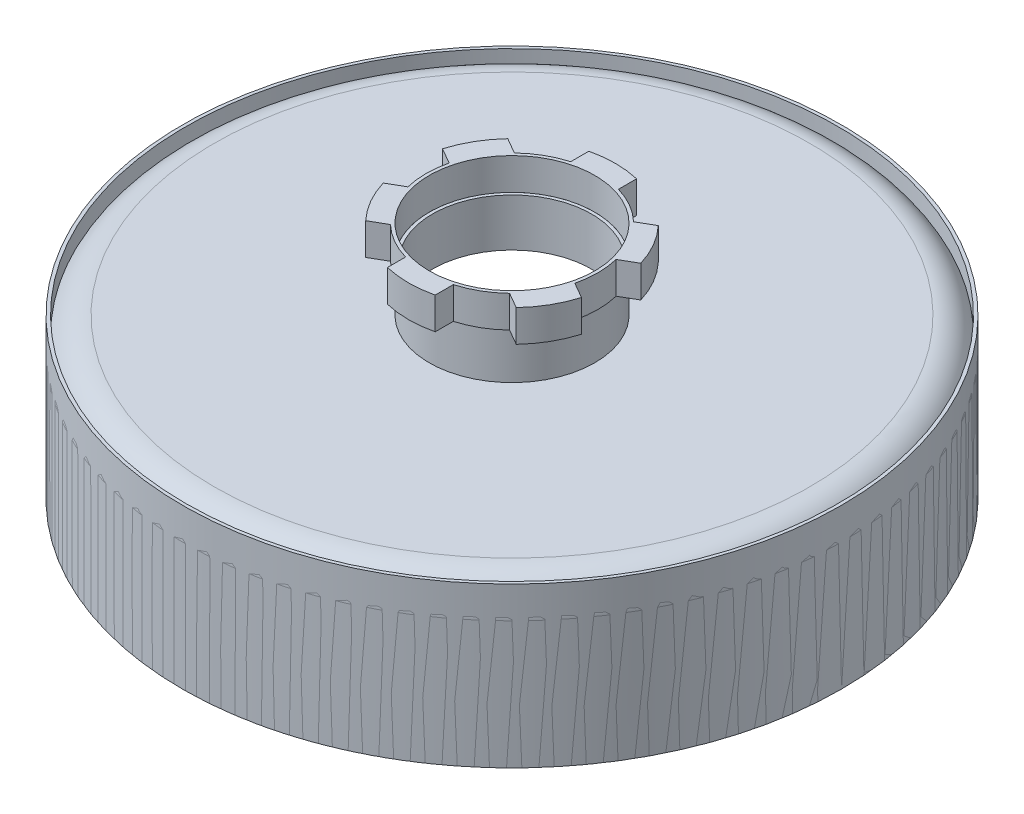
ISO-10303-21;
HEADER;
FILE_DESCRIPTION(('STEP AP214'),'2;1');
FILE_NAME('part.step','',(''),(''),'','','');
FILE_SCHEMA(('AUTOMOTIVE_DESIGN { 1 0 10303 214 1 1 1 1 }'));
ENDSEC;
DATA;
#1=APPLICATION_CONTEXT('core data for automotive mechanical design processes');
#2=APPLICATION_PROTOCOL_DEFINITION('international standard','automotive_design',2000,#1);
#3=PRODUCT_CONTEXT('',#1,'mechanical');
#4=PRODUCT('Part','Part','',(#3));
#5=PRODUCT_RELATED_PRODUCT_CATEGORY('part','',(#4));
#6=PRODUCT_DEFINITION_FORMATION('','',#4);
#7=PRODUCT_DEFINITION_CONTEXT('part definition',#1,'design');
#8=PRODUCT_DEFINITION('design','',#6,#7);
#9=PRODUCT_DEFINITION_SHAPE('','',#8);
#10=(LENGTH_UNIT() NAMED_UNIT(*) SI_UNIT(.MILLI.,.METRE.));
#11=(NAMED_UNIT(*) PLANE_ANGLE_UNIT() SI_UNIT($,.RADIAN.));
#12=(NAMED_UNIT(*) SI_UNIT($,.STERADIAN.) SOLID_ANGLE_UNIT());
#13=UNCERTAINTY_MEASURE_WITH_UNIT(LENGTH_MEASURE(1.E-05),#10,'distance_accuracy_value','');
#14=(GEOMETRIC_REPRESENTATION_CONTEXT(3) GLOBAL_UNCERTAINTY_ASSIGNED_CONTEXT((#13)) GLOBAL_UNIT_ASSIGNED_CONTEXT((#10,
#11,#12)) REPRESENTATION_CONTEXT('',''));
#15=CARTESIAN_POINT('',(0.,0.,0.));
#16=DIRECTION('',(0.,0.,1.));
#17=DIRECTION('',(1.,0.,0.));
#18=AXIS2_PLACEMENT_3D('',#15,#16,#17);
#19=CARTESIAN_POINT('',(0.,25.,0.));
#20=DIRECTION('',(0.,-1.,0.));
#21=DIRECTION('',(0.,0.,-1.));
#22=AXIS2_PLACEMENT_3D('',#19,#20,#21);
#23=CYLINDRICAL_SURFACE('',#22,27.);
#24=DIRECTION('',(0.,-1.,0.));
#25=VECTOR('',#24,1.);
#26=CARTESIAN_POINT('',(-7.50000000000018,25.,25.9374246986858));
#27=LINE('',#26,#25);
#28=CARTESIAN_POINT('',(-7.50000000000018,25.,25.9374246986858));
#29=VERTEX_POINT('',#28);
#30=CARTESIAN_POINT('',(-7.50000000000018,15.,25.9374246986858));
#31=VERTEX_POINT('',#30);
#32=EDGE_CURVE('E14',#29,#31,#27,.T.);
#33=ORIENTED_EDGE('',*,*,#32,.F.);
#34=CARTESIAN_POINT('',(0.,25.,0.));
#35=DIRECTION('',(0.,1.,0.));
#36=DIRECTION('',(1.,0.,0.));
#37=AXIS2_PLACEMENT_3D('',#34,#35,#36);
#38=CIRCLE('',#37,27.);
#39=CARTESIAN_POINT('',(-18.7124686978081,25.,19.4639028777261));
#40=VERTEX_POINT('',#39);
#41=EDGE_CURVE('E251',#40,#29,#38,.T.);
#42=ORIENTED_EDGE('',*,*,#41,.F.);
#43=DIRECTION('',(0.,-1.,0.));
#44=VECTOR('',#43,1.);
#45=CARTESIAN_POINT('',(-18.7124686978081,25.,19.4639028777261));
#46=LINE('',#45,#44);
#47=CARTESIAN_POINT('',(-18.7124686978081,15.,19.4639028777261));
#48=VERTEX_POINT('',#47);
#49=EDGE_CURVE('E413',#40,#48,#46,.T.);
#50=ORIENTED_EDGE('',*,*,#49,.T.);
#51=CARTESIAN_POINT('',(0.,15.,0.));
#52=DIRECTION('',(0.,1.,0.));
#53=DIRECTION('',(1.,0.,0.));
#54=AXIS2_PLACEMENT_3D('',#51,#52,#53);
#55=CIRCLE('',#54,27.);
#56=EDGE_CURVE('E96',#48,#31,#55,.T.);
#57=ORIENTED_EDGE('',*,*,#56,.T.);
#58=EDGE_LOOP('',(#33,#42,#50,#57));
#59=FACE_BOUND('',#58,.T.);
#60=ADVANCED_FACE('F81',(#59),#23,.T.);
#61=DIRECTION('',(0.,-1.,0.));
#62=VECTOR('',#61,1.);
#63=CARTESIAN_POINT('',(-26.212468697808,25.,6.47352182095941));
#64=LINE('',#63,#62);
#65=CARTESIAN_POINT('',(-26.212468697808,25.,6.47352182095941));
#66=VERTEX_POINT('',#65);
#67=CARTESIAN_POINT('',(-26.212468697808,15.,6.47352182095941));
#68=VERTEX_POINT('',#67);
#69=EDGE_CURVE('E415',#66,#68,#64,.T.);
#70=ORIENTED_EDGE('',*,*,#69,.F.);
#71=CARTESIAN_POINT('',(-26.2124686978078,25.,-6.47352182095995));
#72=VERTEX_POINT('',#71);
#73=EDGE_CURVE('E450',#72,#66,#38,.T.);
#74=ORIENTED_EDGE('',*,*,#73,.F.);
#75=DIRECTION('',(0.,-1.,0.));
#76=VECTOR('',#75,1.);
#77=CARTESIAN_POINT('',(-26.2124686978078,25.,-6.47352182095995));
#78=LINE('',#77,#76);
#79=CARTESIAN_POINT('',(-26.2124686978078,15.,-6.47352182095995));
#80=VERTEX_POINT('',#79);
#81=EDGE_CURVE('E407',#72,#80,#78,.T.);
#82=ORIENTED_EDGE('',*,*,#81,.T.);
#83=EDGE_CURVE('E426',#80,#68,#55,.T.);
#84=ORIENTED_EDGE('',*,*,#83,.T.);
#85=EDGE_LOOP('',(#70,#74,#82,#84));
#86=FACE_BOUND('',#85,.T.);
#87=ADVANCED_FACE('F492',(#86),#23,.T.);
#88=DIRECTION('',(0.,-1.,0.));
#89=VECTOR('',#88,1.);
#90=CARTESIAN_POINT('',(-18.7124686978077,25.,-19.4639028777264));
#91=LINE('',#90,#89);
#92=CARTESIAN_POINT('',(-18.7124686978077,25.,-19.4639028777264));
#93=VERTEX_POINT('',#92);
#94=CARTESIAN_POINT('',(-18.7124686978077,15.,-19.4639028777264));
#95=VERTEX_POINT('',#94);
#96=EDGE_CURVE('E410',#93,#95,#91,.T.);
#97=ORIENTED_EDGE('',*,*,#96,.F.);
#98=CARTESIAN_POINT('',(-7.5,25.,-25.9374246986859));
#99=VERTEX_POINT('',#98);
#100=EDGE_CURVE('E449',#99,#93,#38,.T.);
#101=ORIENTED_EDGE('',*,*,#100,.F.);
#102=DIRECTION('',(0.,-1.,0.));
#103=VECTOR('',#102,1.);
#104=CARTESIAN_POINT('',(-7.5,25.,-25.9374246986859));
#105=LINE('',#104,#103);
#106=CARTESIAN_POINT('',(-7.5,15.,-25.9374246986859));
#107=VERTEX_POINT('',#106);
#108=EDGE_CURVE('E401',#99,#107,#105,.T.);
#109=ORIENTED_EDGE('',*,*,#108,.T.);
#110=EDGE_CURVE('E427',#107,#95,#55,.T.);
#111=ORIENTED_EDGE('',*,*,#110,.T.);
#112=EDGE_LOOP('',(#97,#101,#109,#111));
#113=FACE_BOUND('',#112,.T.);
#114=ADVANCED_FACE('F498',(#113),#23,.T.);
#115=DIRECTION('',(0.,-1.,0.));
#116=VECTOR('',#115,1.);
#117=CARTESIAN_POINT('',(7.5,25.,-25.9374246986859));
#118=LINE('',#117,#116);
#119=CARTESIAN_POINT('',(7.5,25.,-25.9374246986859));
#120=VERTEX_POINT('',#119);
#121=CARTESIAN_POINT('',(7.5,15.,-25.9374246986859));
#122=VERTEX_POINT('',#121);
#123=EDGE_CURVE('E404',#120,#122,#118,.T.);
#124=ORIENTED_EDGE('',*,*,#123,.F.);
#125=CARTESIAN_POINT('',(18.712468697808,25.,-19.4639028777262));
#126=VERTEX_POINT('',#125);
#127=EDGE_CURVE('E361',#126,#120,#38,.T.);
#128=ORIENTED_EDGE('',*,*,#127,.F.);
#129=DIRECTION('',(0.,-1.,0.));
#130=VECTOR('',#129,1.);
#131=CARTESIAN_POINT('',(18.712468697808,25.,-19.4639028777262));
#132=LINE('',#131,#130);
#133=CARTESIAN_POINT('',(18.712468697808,15.,-19.4639028777262));
#134=VERTEX_POINT('',#133);
#135=EDGE_CURVE('E395',#126,#134,#132,.T.);
#136=ORIENTED_EDGE('',*,*,#135,.T.);
#137=EDGE_CURVE('E364',#134,#122,#55,.T.);
#138=ORIENTED_EDGE('',*,*,#137,.T.);
#139=EDGE_LOOP('',(#124,#128,#136,#138));
#140=FACE_BOUND('',#139,.T.);
#141=ADVANCED_FACE('F431',(#140),#23,.T.);
#142=DIRECTION('',(0.,-1.,0.));
#143=VECTOR('',#142,1.);
#144=CARTESIAN_POINT('',(26.2124686978079,25.,-6.47352182095959));
#145=LINE('',#144,#143);
#146=CARTESIAN_POINT('',(26.2124686978079,25.,-6.47352182095959));
#147=VERTEX_POINT('',#146);
#148=CARTESIAN_POINT('',(26.2124686978079,15.,-6.47352182095959));
#149=VERTEX_POINT('',#148);
#150=EDGE_CURVE('E398',#147,#149,#145,.T.);
#151=ORIENTED_EDGE('',*,*,#150,.F.);
#152=CARTESIAN_POINT('',(26.2124686978079,25.,6.47352182095977));
#153=VERTEX_POINT('',#152);
#154=EDGE_CURVE('E357',#153,#147,#38,.T.);
#155=ORIENTED_EDGE('',*,*,#154,.F.);
#156=DIRECTION('',(0.,-1.,0.));
#157=VECTOR('',#156,1.);
#158=CARTESIAN_POINT('',(26.2124686978079,25.,6.47352182095977));
#159=LINE('',#158,#157);
#160=CARTESIAN_POINT('',(26.2124686978079,15.,6.47352182095977));
#161=VERTEX_POINT('',#160);
#162=EDGE_CURVE('E360',#161,#153,#159,.F.);
#163=ORIENTED_EDGE('',*,*,#162,.F.);
#164=EDGE_CURVE('E362',#161,#149,#55,.T.);
#165=ORIENTED_EDGE('',*,*,#164,.T.);
#166=EDGE_LOOP('',(#151,#155,#163,#165));
#167=FACE_BOUND('',#166,.T.);
#168=ADVANCED_FACE('F470',(#167),#23,.T.);
#169=CARTESIAN_POINT('',(-3.75000000000003,25.,6.49519052838327));
#170=DIRECTION('',(0.500000000000004,0.,-0.866025403784436));
#171=DIRECTION('',(-0.866025403784436,0.,-0.500000000000004));
#172=AXIS2_PLACEMENT_3D('',#169,#170,#171);
#173=PLANE('',#172);
#174=DIRECTION('',(0.,-1.,0.));
#175=VECTOR('',#174,1.);
#176=CARTESIAN_POINT('',(18.7124686978078,25.,19.4639028777263));
#177=LINE('',#176,#175);
#178=CARTESIAN_POINT('',(18.7124686978078,15.,19.4639028777263));
#179=VERTEX_POINT('',#178);
#180=CARTESIAN_POINT('',(18.7124686978078,25.,19.4639028777263));
#181=VERTEX_POINT('',#180);
#182=EDGE_CURVE('E367',#179,#181,#177,.F.);
#183=ORIENTED_EDGE('',*,*,#182,.F.);
#184=DIRECTION('',(0.866025403784436,0.,0.500000000000004));
#185=VECTOR('',#184,1.);
#186=CARTESIAN_POINT('',(-3.75000000000003,15.,6.49519052838327));
#187=LINE('',#186,#185);
#188=CARTESIAN_POINT('',(23.6361278752582,15.,22.3065788292253));
#189=VERTEX_POINT('',#188);
#190=EDGE_CURVE('E384',#179,#189,#187,.T.);
#191=ORIENTED_EDGE('',*,*,#190,.T.);
#192=DIRECTION('',(0.,-1.,0.));
#193=VECTOR('',#192,1.);
#194=CARTESIAN_POINT('',(23.6361278752582,25.,22.3065788292253));
#195=LINE('',#194,#193);
#196=CARTESIAN_POINT('',(23.6361278752582,25.,22.3065788292253));
#197=VERTEX_POINT('',#196);
#198=EDGE_CURVE('E392',#197,#189,#195,.T.);
#199=ORIENTED_EDGE('',*,*,#198,.F.);
#200=DIRECTION('',(0.866025403784436,0.,0.500000000000004));
#201=VECTOR('',#200,1.);
#202=CARTESIAN_POINT('',(-3.75000000000003,25.,6.49519052838327));
#203=LINE('',#202,#201);
#204=EDGE_CURVE('E373',#181,#197,#203,.T.);
#205=ORIENTED_EDGE('',*,*,#204,.F.);
#206=EDGE_LOOP('',(#183,#191,#199,#205));
#207=FACE_BOUND('',#206,.T.);
#208=ADVANCED_FACE('F458',(#207),#173,.F.);
#209=CARTESIAN_POINT('',(3.75000000000003,25.,-6.49519052838327));
#210=DIRECTION('',(0.500000000000004,0.,-0.866025403784436));
#211=DIRECTION('',(-0.866025403784436,0.,-0.500000000000004));
#212=AXIS2_PLACEMENT_3D('',#209,#210,#211);
#213=PLANE('',#212);
#214=DIRECTION('',(0.866025403784436,0.,0.500000000000004));
#215=VECTOR('',#214,1.);
#216=CARTESIAN_POINT('',(3.75000000000003,15.,-6.49519052838327));
#217=LINE('',#216,#215);
#218=CARTESIAN_POINT('',(31.1361278752583,15.,9.31619777245874));
#219=VERTEX_POINT('',#218);
#220=EDGE_CURVE('E374',#161,#219,#217,.T.);
#221=ORIENTED_EDGE('',*,*,#220,.F.);
#222=ORIENTED_EDGE('',*,*,#162,.T.);
#223=DIRECTION('',(0.866025403784436,0.,0.500000000000004));
#224=VECTOR('',#223,1.);
#225=CARTESIAN_POINT('',(3.75000000000003,25.,-6.49519052838327));
#226=LINE('',#225,#224);
#227=CARTESIAN_POINT('',(31.1361278752583,25.,9.31619777245874));
#228=VERTEX_POINT('',#227);
#229=EDGE_CURVE('E379',#153,#228,#226,.T.);
#230=ORIENTED_EDGE('',*,*,#229,.T.);
#231=DIRECTION('',(0.,-1.,0.));
#232=VECTOR('',#231,1.);
#233=CARTESIAN_POINT('',(31.1361278752583,25.,9.31619777245874));
#234=LINE('',#233,#232);
#235=EDGE_CURVE('E381',#228,#219,#234,.T.);
#236=ORIENTED_EDGE('',*,*,#235,.T.);
#237=EDGE_LOOP('',(#221,#222,#230,#236));
#238=FACE_BOUND('',#237,.T.);
#239=ADVANCED_FACE('F467',(#238),#213,.T.);
#240=CARTESIAN_POINT('',(0.,25.,0.));
#241=DIRECTION('',(0.,-1.,0.));
#242=DIRECTION('',(0.,0.,-1.));
#243=AXIS2_PLACEMENT_3D('',#240,#241,#242);
#244=CYLINDRICAL_SURFACE('',#243,26.);
#245=CARTESIAN_POINT('',(0.,15.,0.));
#246=DIRECTION('',(0.,1.,0.));
#247=DIRECTION('',(0.,0.,1.));
#248=AXIS2_PLACEMENT_3D('',#245,#246,#247);
#249=CIRCLE('',#248,26.);
#250=CARTESIAN_POINT('',(0.,15.,26.));
#251=VERTEX_POINT('',#250);
#252=EDGE_CURVE('E369',#251,#251,#249,.T.);
#253=ORIENTED_EDGE('',*,*,#252,.F.);
#254=EDGE_LOOP('',(#253));
#255=FACE_BOUND('',#254,.T.);
#256=CARTESIAN_POINT('',(0.,25.,0.));
#257=DIRECTION('',(0.,1.,0.));
#258=DIRECTION('',(0.,0.,1.));
#259=AXIS2_PLACEMENT_3D('',#256,#257,#258);
#260=CIRCLE('',#259,26.);
#261=CARTESIAN_POINT('',(0.,25.,26.));
#262=VERTEX_POINT('',#261);
#263=EDGE_CURVE('E370',#262,#262,#260,.T.);
#264=ORIENTED_EDGE('',*,*,#263,.T.);
#265=EDGE_LOOP('',(#264));
#266=FACE_BOUND('',#265,.T.);
#267=ADVANCED_FACE('F83',(#255,#266),#244,.F.);
#268=CARTESIAN_POINT('',(0.,25.,0.));
#269=DIRECTION('',(0.,-1.,0.));
#270=DIRECTION('',(0.,0.,-1.));
#271=AXIS2_PLACEMENT_3D('',#268,#269,#270);
#272=CYLINDRICAL_SURFACE('',#271,32.5);
#273=CARTESIAN_POINT('',(0.,15.,0.));
#274=DIRECTION('',(0.,1.,0.));
#275=DIRECTION('',(0.,0.,1.));
#276=AXIS2_PLACEMENT_3D('',#273,#274,#275);
#277=CIRCLE('',#276,32.5);
#278=EDGE_CURVE('E386',#189,#219,#277,.T.);
#279=ORIENTED_EDGE('',*,*,#278,.T.);
#280=ORIENTED_EDGE('',*,*,#235,.F.);
#281=CARTESIAN_POINT('',(0.,25.,0.));
#282=DIRECTION('',(0.,1.,0.));
#283=DIRECTION('',(0.,0.,1.));
#284=AXIS2_PLACEMENT_3D('',#281,#282,#283);
#285=CIRCLE('',#284,32.5);
#286=EDGE_CURVE('E376',#197,#228,#285,.T.);
#287=ORIENTED_EDGE('',*,*,#286,.F.);
#288=ORIENTED_EDGE('',*,*,#198,.T.);
#289=EDGE_LOOP('',(#279,#280,#287,#288));
#290=FACE_BOUND('',#289,.T.);
#291=ADVANCED_FACE('F462',(#290),#272,.T.);
#292=CARTESIAN_POINT('',(0.,25.,0.));
#293=DIRECTION('',(0.,1.,0.));
#294=DIRECTION('',(0.,0.,1.));
#295=AXIS2_PLACEMENT_3D('',#292,#293,#294);
#296=PLANE('',#295);
#297=ORIENTED_EDGE('',*,*,#263,.F.);
#298=EDGE_LOOP('',(#297));
#299=FACE_BOUND('',#298,.T.);
#300=ORIENTED_EDGE('',*,*,#41,.T.);
#301=DIRECTION('',(0.,0.,1.));
#302=VECTOR('',#301,1.);
#303=CARTESIAN_POINT('',(-7.5,25.,0.));
#304=LINE('',#303,#302);
#305=CARTESIAN_POINT('',(-7.50000000000022,25.,31.6227766016837));
#306=VERTEX_POINT('',#305);
#307=EDGE_CURVE('E243',#29,#306,#304,.T.);
#308=ORIENTED_EDGE('',*,*,#307,.T.);
#309=CARTESIAN_POINT('',(0.,25.,0.));
#310=DIRECTION('',(0.,1.,0.));
#311=DIRECTION('',(0.,0.,1.));
#312=AXIS2_PLACEMENT_3D('',#309,#310,#311);
#313=CIRCLE('',#312,32.5);
#314=CARTESIAN_POINT('',(7.49999999999978,25.,31.6227766016838));
#315=VERTEX_POINT('',#314);
#316=EDGE_CURVE('E248',#306,#315,#313,.T.);
#317=ORIENTED_EDGE('',*,*,#316,.T.);
#318=DIRECTION('',(0.,0.,1.));
#319=VECTOR('',#318,1.);
#320=CARTESIAN_POINT('',(7.5,25.,0.));
#321=LINE('',#320,#319);
#322=CARTESIAN_POINT('',(7.49999999999982,25.,25.9374246986859));
#323=VERTEX_POINT('',#322);
#324=EDGE_CURVE('E268',#323,#315,#321,.T.);
#325=ORIENTED_EDGE('',*,*,#324,.F.);
#326=EDGE_CURVE('E103',#323,#181,#38,.T.);
#327=ORIENTED_EDGE('',*,*,#326,.T.);
#328=ORIENTED_EDGE('',*,*,#204,.T.);
#329=ORIENTED_EDGE('',*,*,#286,.T.);
#330=ORIENTED_EDGE('',*,*,#229,.F.);
#331=ORIENTED_EDGE('',*,*,#154,.T.);
#332=DIRECTION('',(0.86602540378444,0.,-0.499999999999998));
#333=VECTOR('',#332,1.);
#334=CARTESIAN_POINT('',(3.74999999999999,25.,6.4951905283833));
#335=LINE('',#334,#333);
#336=CARTESIAN_POINT('',(31.1361278752583,25.,-9.31619777245853));
#337=VERTEX_POINT('',#336);
#338=EDGE_CURVE('E337',#147,#337,#335,.T.);
#339=ORIENTED_EDGE('',*,*,#338,.T.);
#340=CARTESIAN_POINT('',(0.,25.,0.));
#341=DIRECTION('',(0.,1.,0.));
#342=DIRECTION('',(0.,0.,1.));
#343=AXIS2_PLACEMENT_3D('',#340,#341,#342);
#344=CIRCLE('',#343,32.5);
#345=CARTESIAN_POINT('',(23.6361278752584,25.,-22.3065788292251));
#346=VERTEX_POINT('',#345);
#347=EDGE_CURVE('E339',#337,#346,#344,.T.);
#348=ORIENTED_EDGE('',*,*,#347,.T.);
#349=DIRECTION('',(0.86602540378444,0.,-0.499999999999998));
#350=VECTOR('',#349,1.);
#351=CARTESIAN_POINT('',(-3.74999999999998,25.,-6.4951905283833));
#352=LINE('',#351,#350);
#353=EDGE_CURVE('E343',#126,#346,#352,.T.);
#354=ORIENTED_EDGE('',*,*,#353,.F.);
#355=ORIENTED_EDGE('',*,*,#127,.T.);
#356=DIRECTION('',(0.,0.,-1.));
#357=VECTOR('',#356,1.);
#358=CARTESIAN_POINT('',(7.5,25.,0.));
#359=LINE('',#358,#357);
#360=CARTESIAN_POINT('',(7.5,25.,-31.6227766016838));
#361=VERTEX_POINT('',#360);
#362=EDGE_CURVE('E317',#120,#361,#359,.T.);
#363=ORIENTED_EDGE('',*,*,#362,.T.);
#364=CARTESIAN_POINT('',(0.,25.,0.));
#365=DIRECTION('',(0.,1.,0.));
#366=DIRECTION('',(0.,0.,1.));
#367=AXIS2_PLACEMENT_3D('',#364,#365,#366);
#368=CIRCLE('',#367,32.5);
#369=CARTESIAN_POINT('',(-7.5,25.,-31.6227766016838));
#370=VERTEX_POINT('',#369);
#371=EDGE_CURVE('E319',#361,#370,#368,.T.);
#372=ORIENTED_EDGE('',*,*,#371,.T.);
#373=DIRECTION('',(0.,0.,-1.));
#374=VECTOR('',#373,1.);
#375=CARTESIAN_POINT('',(-7.5,25.,0.));
#376=LINE('',#375,#374);
#377=EDGE_CURVE('E323',#99,#370,#376,.T.);
#378=ORIENTED_EDGE('',*,*,#377,.F.);
#379=ORIENTED_EDGE('',*,*,#100,.T.);
#380=DIRECTION('',(-0.866025403784433,0.,-0.50000000000001));
#381=VECTOR('',#380,1.);
#382=CARTESIAN_POINT('',(3.75000000000008,25.,-6.49519052838325));
#383=LINE('',#382,#381);
#384=CARTESIAN_POINT('',(-23.636127875258,25.,-22.3065788292255));
#385=VERTEX_POINT('',#384);
#386=EDGE_CURVE('E297',#93,#385,#383,.T.);
#387=ORIENTED_EDGE('',*,*,#386,.T.);
#388=CARTESIAN_POINT('',(0.,25.,0.));
#389=DIRECTION('',(0.,1.,0.));
#390=DIRECTION('',(0.,0.,1.));
#391=AXIS2_PLACEMENT_3D('',#388,#389,#390);
#392=CIRCLE('',#391,32.5);
#393=CARTESIAN_POINT('',(-31.1361278752582,25.,-9.31619777245897));
#394=VERTEX_POINT('',#393);
#395=EDGE_CURVE('E299',#385,#394,#392,.T.);
#396=ORIENTED_EDGE('',*,*,#395,.T.);
#397=DIRECTION('',(-0.866025403784433,0.,-0.50000000000001));
#398=VECTOR('',#397,1.);
#399=CARTESIAN_POINT('',(-3.75000000000008,25.,6.49519052838325));
#400=LINE('',#399,#398);
#401=EDGE_CURVE('E303',#72,#394,#400,.T.);
#402=ORIENTED_EDGE('',*,*,#401,.F.);
#403=ORIENTED_EDGE('',*,*,#73,.T.);
#404=DIRECTION('',(-0.866025403784443,0.,0.499999999999992));
#405=VECTOR('',#404,1.);
#406=CARTESIAN_POINT('',(-3.74999999999994,25.,-6.49519052838332));
#407=LINE('',#406,#405);
#408=CARTESIAN_POINT('',(-31.1361278752584,25.,9.31619777245832));
#409=VERTEX_POINT('',#408);
#410=EDGE_CURVE('E277',#66,#409,#407,.T.);
#411=ORIENTED_EDGE('',*,*,#410,.T.);
#412=CARTESIAN_POINT('',(0.,25.,0.));
#413=DIRECTION('',(0.,1.,0.));
#414=DIRECTION('',(0.,0.,1.));
#415=AXIS2_PLACEMENT_3D('',#412,#413,#414);
#416=CIRCLE('',#415,32.5);
#417=CARTESIAN_POINT('',(-23.6361278752585,25.,22.306578829225));
#418=VERTEX_POINT('',#417);
#419=EDGE_CURVE('E279',#409,#418,#416,.T.);
#420=ORIENTED_EDGE('',*,*,#419,.T.);
#421=DIRECTION('',(-0.866025403784443,0.,0.499999999999992));
#422=VECTOR('',#421,1.);
#423=CARTESIAN_POINT('',(3.74999999999994,25.,6.49519052838333));
#424=LINE('',#423,#422);
#425=EDGE_CURVE('E283',#40,#418,#424,.T.);
#426=ORIENTED_EDGE('',*,*,#425,.F.);
#427=EDGE_LOOP('',(#300,#308,#317,#325,#327,#328,#329,#330,#331,#339,#348,#354,#355,#363,#372,
#378,#379,#387,#396,#402,#403,#411,#420,#426));
#428=FACE_BOUND('',#427,.T.);
#429=ADVANCED_FACE('F245',(#299,#428),#296,.T.);
#430=CARTESIAN_POINT('',(0.,15.,0.));
#431=DIRECTION('',(0.,1.,0.));
#432=DIRECTION('',(0.,0.,1.));
#433=AXIS2_PLACEMENT_3D('',#430,#431,#432);
#434=PLANE('',#433);
#435=ORIENTED_EDGE('',*,*,#252,.T.);
#436=EDGE_LOOP('',(#435));
#437=FACE_BOUND('',#436,.T.);
#438=DIRECTION('',(0.,0.,1.));
#439=VECTOR('',#438,1.);
#440=CARTESIAN_POINT('',(-7.5,15.,0.));
#441=LINE('',#440,#439);
#442=CARTESIAN_POINT('',(-7.50000000000022,15.,31.6227766016837));
#443=VERTEX_POINT('',#442);
#444=EDGE_CURVE('E259',#31,#443,#441,.T.);
#445=ORIENTED_EDGE('',*,*,#444,.F.);
#446=ORIENTED_EDGE('',*,*,#56,.F.);
#447=DIRECTION('',(-0.866025403784443,0.,0.499999999999992));
#448=VECTOR('',#447,1.);
#449=CARTESIAN_POINT('',(3.74999999999994,15.,6.49519052838333));
#450=LINE('',#449,#448);
#451=CARTESIAN_POINT('',(-23.6361278752585,15.,22.306578829225));
#452=VERTEX_POINT('',#451);
#453=EDGE_CURVE('E280',#48,#452,#450,.T.);
#454=ORIENTED_EDGE('',*,*,#453,.T.);
#455=CARTESIAN_POINT('',(0.,15.,0.));
#456=DIRECTION('',(0.,1.,0.));
#457=DIRECTION('',(0.,0.,1.));
#458=AXIS2_PLACEMENT_3D('',#455,#456,#457);
#459=CIRCLE('',#458,32.5);
#460=CARTESIAN_POINT('',(-31.1361278752584,15.,9.31619777245832));
#461=VERTEX_POINT('',#460);
#462=EDGE_CURVE('E287',#461,#452,#459,.T.);
#463=ORIENTED_EDGE('',*,*,#462,.F.);
#464=DIRECTION('',(-0.866025403784443,0.,0.499999999999992));
#465=VECTOR('',#464,1.);
#466=CARTESIAN_POINT('',(-3.74999999999994,15.,-6.49519052838332));
#467=LINE('',#466,#465);
#468=EDGE_CURVE('E263',#68,#461,#467,.T.);
#469=ORIENTED_EDGE('',*,*,#468,.F.);
#470=ORIENTED_EDGE('',*,*,#83,.F.);
#471=DIRECTION('',(-0.866025403784433,0.,-0.50000000000001));
#472=VECTOR('',#471,1.);
#473=CARTESIAN_POINT('',(-3.75000000000008,15.,6.49519052838325));
#474=LINE('',#473,#472);
#475=CARTESIAN_POINT('',(-31.1361278752582,15.,-9.31619777245897));
#476=VERTEX_POINT('',#475);
#477=EDGE_CURVE('E300',#80,#476,#474,.T.);
#478=ORIENTED_EDGE('',*,*,#477,.T.);
#479=CARTESIAN_POINT('',(0.,15.,0.));
#480=DIRECTION('',(0.,1.,0.));
#481=DIRECTION('',(0.,0.,1.));
#482=AXIS2_PLACEMENT_3D('',#479,#480,#481);
#483=CIRCLE('',#482,32.5);
#484=CARTESIAN_POINT('',(-23.636127875258,15.,-22.3065788292255));
#485=VERTEX_POINT('',#484);
#486=EDGE_CURVE('E307',#485,#476,#483,.T.);
#487=ORIENTED_EDGE('',*,*,#486,.F.);
#488=DIRECTION('',(-0.866025403784433,0.,-0.50000000000001));
#489=VECTOR('',#488,1.);
#490=CARTESIAN_POINT('',(3.75000000000008,15.,-6.49519052838325));
#491=LINE('',#490,#489);
#492=EDGE_CURVE('E296',#95,#485,#491,.T.);
#493=ORIENTED_EDGE('',*,*,#492,.F.);
#494=ORIENTED_EDGE('',*,*,#110,.F.);
#495=DIRECTION('',(0.,0.,-1.));
#496=VECTOR('',#495,1.);
#497=CARTESIAN_POINT('',(-7.5,15.,0.));
#498=LINE('',#497,#496);
#499=CARTESIAN_POINT('',(-7.5,15.,-31.6227766016838));
#500=VERTEX_POINT('',#499);
#501=EDGE_CURVE('E320',#107,#500,#498,.T.);
#502=ORIENTED_EDGE('',*,*,#501,.T.);
#503=CARTESIAN_POINT('',(0.,15.,0.));
#504=DIRECTION('',(0.,1.,0.));
#505=DIRECTION('',(0.,0.,1.));
#506=AXIS2_PLACEMENT_3D('',#503,#504,#505);
#507=CIRCLE('',#506,32.5);
#508=CARTESIAN_POINT('',(7.5,15.,-31.6227766016838));
#509=VERTEX_POINT('',#508);
#510=EDGE_CURVE('E327',#509,#500,#507,.T.);
#511=ORIENTED_EDGE('',*,*,#510,.F.);
#512=DIRECTION('',(0.,0.,-1.));
#513=VECTOR('',#512,1.);
#514=CARTESIAN_POINT('',(7.5,15.,0.));
#515=LINE('',#514,#513);
#516=EDGE_CURVE('E316',#122,#509,#515,.T.);
#517=ORIENTED_EDGE('',*,*,#516,.F.);
#518=ORIENTED_EDGE('',*,*,#137,.F.);
#519=DIRECTION('',(0.86602540378444,0.,-0.499999999999998));
#520=VECTOR('',#519,1.);
#521=CARTESIAN_POINT('',(-3.74999999999998,15.,-6.4951905283833));
#522=LINE('',#521,#520);
#523=CARTESIAN_POINT('',(23.6361278752584,15.,-22.3065788292251));
#524=VERTEX_POINT('',#523);
#525=EDGE_CURVE('E340',#134,#524,#522,.T.);
#526=ORIENTED_EDGE('',*,*,#525,.T.);
#527=CARTESIAN_POINT('',(0.,15.,0.));
#528=DIRECTION('',(0.,1.,0.));
#529=DIRECTION('',(0.,0.,1.));
#530=AXIS2_PLACEMENT_3D('',#527,#528,#529);
#531=CIRCLE('',#530,32.5);
#532=CARTESIAN_POINT('',(31.1361278752583,15.,-9.31619777245853));
#533=VERTEX_POINT('',#532);
#534=EDGE_CURVE('E347',#533,#524,#531,.T.);
#535=ORIENTED_EDGE('',*,*,#534,.F.);
#536=DIRECTION('',(0.86602540378444,0.,-0.499999999999998));
#537=VECTOR('',#536,1.);
#538=CARTESIAN_POINT('',(3.74999999999999,15.,6.4951905283833));
#539=LINE('',#538,#537);
#540=EDGE_CURVE('E336',#149,#533,#539,.T.);
#541=ORIENTED_EDGE('',*,*,#540,.F.);
#542=ORIENTED_EDGE('',*,*,#164,.F.);
#543=ORIENTED_EDGE('',*,*,#220,.T.);
#544=ORIENTED_EDGE('',*,*,#278,.F.);
#545=ORIENTED_EDGE('',*,*,#190,.F.);
#546=CARTESIAN_POINT('',(7.49999999999982,15.,25.9374246986859));
#547=VERTEX_POINT('',#546);
#548=EDGE_CURVE('E356',#547,#179,#55,.T.);
#549=ORIENTED_EDGE('',*,*,#548,.F.);
#550=DIRECTION('',(0.,0.,1.));
#551=VECTOR('',#550,1.);
#552=CARTESIAN_POINT('',(7.5,15.,0.));
#553=LINE('',#552,#551);
#554=CARTESIAN_POINT('',(7.49999999999978,15.,31.6227766016838));
#555=VERTEX_POINT('',#554);
#556=EDGE_CURVE('E253',#547,#555,#553,.T.);
#557=ORIENTED_EDGE('',*,*,#556,.T.);
#558=CARTESIAN_POINT('',(0.,15.,0.));
#559=DIRECTION('',(0.,1.,0.));
#560=DIRECTION('',(0.,0.,1.));
#561=AXIS2_PLACEMENT_3D('',#558,#559,#560);
#562=CIRCLE('',#561,32.5);
#563=EDGE_CURVE('E273',#443,#555,#562,.T.);
#564=ORIENTED_EDGE('',*,*,#563,.F.);
#565=EDGE_LOOP('',(#445,#446,#454,#463,#469,#470,#478,#487,#493,#494,#502,#511,#517,#518,#526,
#535,#541,#542,#543,#544,#545,#549,#557,#564));
#566=FACE_BOUND('',#565,.T.);
#567=ADVANCED_FACE('F423',(#437,#566),#434,.F.);
#568=ORIENTED_EDGE('',*,*,#326,.F.);
#569=DIRECTION('',(0.,-1.,0.));
#570=VECTOR('',#569,1.);
#571=CARTESIAN_POINT('',(7.49999999999982,25.,25.9374246986859));
#572=LINE('',#571,#570);
#573=EDGE_CURVE('E89',#323,#547,#572,.T.);
#574=ORIENTED_EDGE('',*,*,#573,.T.);
#575=ORIENTED_EDGE('',*,*,#548,.T.);
#576=ORIENTED_EDGE('',*,*,#182,.T.);
#577=EDGE_LOOP('',(#568,#574,#575,#576));
#578=FACE_BOUND('',#577,.T.);
#579=ADVANCED_FACE('F418',(#578),#23,.T.);
#580=CARTESIAN_POINT('',(3.74999999999999,25.,6.4951905283833));
#581=DIRECTION('',(-0.499999999999998,0.,-0.86602540378444));
#582=DIRECTION('',(-0.86602540378444,0.,0.499999999999998));
#583=AXIS2_PLACEMENT_3D('',#580,#581,#582);
#584=PLANE('',#583);
#585=ORIENTED_EDGE('',*,*,#338,.F.);
#586=ORIENTED_EDGE('',*,*,#150,.T.);
#587=ORIENTED_EDGE('',*,*,#540,.T.);
#588=DIRECTION('',(0.,-1.,0.));
#589=VECTOR('',#588,1.);
#590=CARTESIAN_POINT('',(31.1361278752583,25.,-9.31619777245853));
#591=LINE('',#590,#589);
#592=EDGE_CURVE('E353',#337,#533,#591,.T.);
#593=ORIENTED_EDGE('',*,*,#592,.F.);
#594=EDGE_LOOP('',(#585,#586,#587,#593));
#595=FACE_BOUND('',#594,.T.);
#596=ADVANCED_FACE('F475',(#595),#584,.F.);
#597=CARTESIAN_POINT('',(-3.74999999999998,25.,-6.4951905283833));
#598=DIRECTION('',(-0.499999999999998,0.,-0.86602540378444));
#599=DIRECTION('',(-0.86602540378444,0.,0.499999999999998));
#600=AXIS2_PLACEMENT_3D('',#597,#598,#599);
#601=PLANE('',#600);
#602=ORIENTED_EDGE('',*,*,#135,.F.);
#603=ORIENTED_EDGE('',*,*,#353,.T.);
#604=DIRECTION('',(0.,-1.,0.));
#605=VECTOR('',#604,1.);
#606=CARTESIAN_POINT('',(23.6361278752584,25.,-22.3065788292251));
#607=LINE('',#606,#605);
#608=EDGE_CURVE('E345',#346,#524,#607,.T.);
#609=ORIENTED_EDGE('',*,*,#608,.T.);
#610=ORIENTED_EDGE('',*,*,#525,.F.);
#611=EDGE_LOOP('',(#602,#603,#609,#610));
#612=FACE_BOUND('',#611,.T.);
#613=ADVANCED_FACE('F481',(#612),#601,.T.);
#614=CARTESIAN_POINT('',(0.,25.,0.));
#615=DIRECTION('',(0.,-1.,0.));
#616=DIRECTION('',(0.,0.,-1.));
#617=AXIS2_PLACEMENT_3D('',#614,#615,#616);
#618=CYLINDRICAL_SURFACE('',#617,32.5);
#619=ORIENTED_EDGE('',*,*,#534,.T.);
#620=ORIENTED_EDGE('',*,*,#608,.F.);
#621=ORIENTED_EDGE('',*,*,#347,.F.);
#622=ORIENTED_EDGE('',*,*,#592,.T.);
#623=EDGE_LOOP('',(#619,#620,#621,#622));
#624=FACE_BOUND('',#623,.T.);
#625=ADVANCED_FACE('F478',(#624),#618,.T.);
#626=CARTESIAN_POINT('',(7.5,25.,0.));
#627=DIRECTION('',(-1.,0.,0.));
#628=DIRECTION('',(0.,0.,1.));
#629=AXIS2_PLACEMENT_3D('',#626,#627,#628);
#630=PLANE('',#629);
#631=ORIENTED_EDGE('',*,*,#362,.F.);
#632=ORIENTED_EDGE('',*,*,#123,.T.);
#633=ORIENTED_EDGE('',*,*,#516,.T.);
#634=DIRECTION('',(0.,-1.,0.));
#635=VECTOR('',#634,1.);
#636=CARTESIAN_POINT('',(7.5,25.,-31.6227766016838));
#637=LINE('',#636,#635);
#638=EDGE_CURVE('E333',#361,#509,#637,.T.);
#639=ORIENTED_EDGE('',*,*,#638,.F.);
#640=EDGE_LOOP('',(#631,#632,#633,#639));
#641=FACE_BOUND('',#640,.T.);
#642=ADVANCED_FACE('F438',(#641),#630,.F.);
#643=CARTESIAN_POINT('',(-7.5,25.,0.));
#644=DIRECTION('',(-1.,0.,0.));
#645=DIRECTION('',(0.,0.,1.));
#646=AXIS2_PLACEMENT_3D('',#643,#644,#645);
#647=PLANE('',#646);
#648=ORIENTED_EDGE('',*,*,#108,.F.);
#649=ORIENTED_EDGE('',*,*,#377,.T.);
#650=DIRECTION('',(0.,-1.,0.));
#651=VECTOR('',#650,1.);
#652=CARTESIAN_POINT('',(-7.5,25.,-31.6227766016838));
#653=LINE('',#652,#651);
#654=EDGE_CURVE('E325',#370,#500,#653,.T.);
#655=ORIENTED_EDGE('',*,*,#654,.T.);
#656=ORIENTED_EDGE('',*,*,#501,.F.);
#657=EDGE_LOOP('',(#648,#649,#655,#656));
#658=FACE_BOUND('',#657,.T.);
#659=ADVANCED_FACE('F560',(#658),#647,.T.);
#660=CARTESIAN_POINT('',(0.,25.,0.));
#661=DIRECTION('',(0.,-1.,0.));
#662=DIRECTION('',(0.,0.,-1.));
#663=AXIS2_PLACEMENT_3D('',#660,#661,#662);
#664=CYLINDRICAL_SURFACE('',#663,32.5);
#665=ORIENTED_EDGE('',*,*,#510,.T.);
#666=ORIENTED_EDGE('',*,*,#654,.F.);
#667=ORIENTED_EDGE('',*,*,#371,.F.);
#668=ORIENTED_EDGE('',*,*,#638,.T.);
#669=EDGE_LOOP('',(#665,#666,#667,#668));
#670=FACE_BOUND('',#669,.T.);
#671=ADVANCED_FACE('F444',(#670),#664,.T.);
#672=CARTESIAN_POINT('',(3.75000000000008,25.,-6.49519052838325));
#673=DIRECTION('',(-0.50000000000001,0.,0.866025403784433));
#674=DIRECTION('',(0.866025403784433,0.,0.50000000000001));
#675=AXIS2_PLACEMENT_3D('',#672,#673,#674);
#676=PLANE('',#675);
#677=ORIENTED_EDGE('',*,*,#386,.F.);
#678=ORIENTED_EDGE('',*,*,#96,.T.);
#679=ORIENTED_EDGE('',*,*,#492,.T.);
#680=DIRECTION('',(0.,-1.,0.));
#681=VECTOR('',#680,1.);
#682=CARTESIAN_POINT('',(-23.636127875258,25.,-22.3065788292255));
#683=LINE('',#682,#681);
#684=EDGE_CURVE('E313',#385,#485,#683,.T.);
#685=ORIENTED_EDGE('',*,*,#684,.F.);
#686=EDGE_LOOP('',(#677,#678,#679,#685));
#687=FACE_BOUND('',#686,.T.);
#688=ADVANCED_FACE('F519',(#687),#676,.F.);
#689=CARTESIAN_POINT('',(-3.75000000000008,25.,6.49519052838325));
#690=DIRECTION('',(-0.50000000000001,0.,0.866025403784433));
#691=DIRECTION('',(0.866025403784433,0.,0.50000000000001));
#692=AXIS2_PLACEMENT_3D('',#689,#690,#691);
#693=PLANE('',#692);
#694=ORIENTED_EDGE('',*,*,#81,.F.);
#695=ORIENTED_EDGE('',*,*,#401,.T.);
#696=DIRECTION('',(0.,-1.,0.));
#697=VECTOR('',#696,1.);
#698=CARTESIAN_POINT('',(-31.1361278752582,25.,-9.31619777245897));
#699=LINE('',#698,#697);
#700=EDGE_CURVE('E305',#394,#476,#699,.T.);
#701=ORIENTED_EDGE('',*,*,#700,.T.);
#702=ORIENTED_EDGE('',*,*,#477,.F.);
#703=EDGE_LOOP('',(#694,#695,#701,#702));
#704=FACE_BOUND('',#703,.T.);
#705=ADVANCED_FACE('F529',(#704),#693,.T.);
#706=CARTESIAN_POINT('',(0.,25.,0.));
#707=DIRECTION('',(0.,-1.,0.));
#708=DIRECTION('',(0.,0.,-1.));
#709=AXIS2_PLACEMENT_3D('',#706,#707,#708);
#710=CYLINDRICAL_SURFACE('',#709,32.5);
#711=ORIENTED_EDGE('',*,*,#486,.T.);
#712=ORIENTED_EDGE('',*,*,#700,.F.);
#713=ORIENTED_EDGE('',*,*,#395,.F.);
#714=ORIENTED_EDGE('',*,*,#684,.T.);
#715=EDGE_LOOP('',(#711,#712,#713,#714));
#716=FACE_BOUND('',#715,.T.);
#717=ADVANCED_FACE('F525',(#716),#710,.T.);
#718=CARTESIAN_POINT('',(-3.74999999999994,25.,-6.49519052838332));
#719=DIRECTION('',(0.499999999999992,0.,0.866025403784443));
#720=DIRECTION('',(0.866025403784443,0.,-0.499999999999992));
#721=AXIS2_PLACEMENT_3D('',#718,#719,#720);
#722=PLANE('',#721);
#723=ORIENTED_EDGE('',*,*,#410,.F.);
#724=ORIENTED_EDGE('',*,*,#69,.T.);
#725=ORIENTED_EDGE('',*,*,#468,.T.);
#726=DIRECTION('',(0.,-1.,0.));
#727=VECTOR('',#726,1.);
#728=CARTESIAN_POINT('',(-31.1361278752584,25.,9.31619777245832));
#729=LINE('',#728,#727);
#730=EDGE_CURVE('E293',#409,#461,#729,.T.);
#731=ORIENTED_EDGE('',*,*,#730,.F.);
#732=EDGE_LOOP('',(#723,#724,#725,#731));
#733=FACE_BOUND('',#732,.T.);
#734=ADVANCED_FACE('F532',(#733),#722,.F.);
#735=CARTESIAN_POINT('',(3.74999999999994,25.,6.49519052838333));
#736=DIRECTION('',(0.499999999999992,0.,0.866025403784443));
#737=DIRECTION('',(0.866025403784443,0.,-0.499999999999992));
#738=AXIS2_PLACEMENT_3D('',#735,#736,#737);
#739=PLANE('',#738);
#740=ORIENTED_EDGE('',*,*,#49,.F.);
#741=ORIENTED_EDGE('',*,*,#425,.T.);
#742=DIRECTION('',(0.,-1.,0.));
#743=VECTOR('',#742,1.);
#744=CARTESIAN_POINT('',(-23.6361278752585,25.,22.306578829225));
#745=LINE('',#744,#743);
#746=EDGE_CURVE('E285',#418,#452,#745,.T.);
#747=ORIENTED_EDGE('',*,*,#746,.T.);
#748=ORIENTED_EDGE('',*,*,#453,.F.);
#749=EDGE_LOOP('',(#740,#741,#747,#748));
#750=FACE_BOUND('',#749,.T.);
#751=ADVANCED_FACE('F542',(#750),#739,.T.);
#752=CARTESIAN_POINT('',(0.,25.,0.));
#753=DIRECTION('',(0.,-1.,0.));
#754=DIRECTION('',(0.,0.,-1.));
#755=AXIS2_PLACEMENT_3D('',#752,#753,#754);
#756=CYLINDRICAL_SURFACE('',#755,32.5);
#757=ORIENTED_EDGE('',*,*,#462,.T.);
#758=ORIENTED_EDGE('',*,*,#746,.F.);
#759=ORIENTED_EDGE('',*,*,#419,.F.);
#760=ORIENTED_EDGE('',*,*,#730,.T.);
#761=EDGE_LOOP('',(#757,#758,#759,#760));
#762=FACE_BOUND('',#761,.T.);
#763=ADVANCED_FACE('F538',(#762),#756,.T.);
#764=CARTESIAN_POINT('',(-7.5,25.,0.));
#765=DIRECTION('',(1.,0.,0.));
#766=DIRECTION('',(0.,0.,-1.));
#767=AXIS2_PLACEMENT_3D('',#764,#765,#766);
#768=PLANE('',#767);
#769=ORIENTED_EDGE('',*,*,#307,.F.);
#770=ORIENTED_EDGE('',*,*,#32,.T.);
#771=ORIENTED_EDGE('',*,*,#444,.T.);
#772=DIRECTION('',(0.,-1.,0.));
#773=VECTOR('',#772,1.);
#774=CARTESIAN_POINT('',(-7.50000000000022,25.,31.6227766016837));
#775=LINE('',#774,#773);
#776=EDGE_CURVE('E256',#306,#443,#775,.T.);
#777=ORIENTED_EDGE('',*,*,#776,.F.);
#778=EDGE_LOOP('',(#769,#770,#771,#777));
#779=FACE_BOUND('',#778,.T.);
#780=ADVANCED_FACE('F257',(#779),#768,.F.);
#781=CARTESIAN_POINT('',(7.5,25.,0.));
#782=DIRECTION('',(1.,0.,0.));
#783=DIRECTION('',(0.,0.,-1.));
#784=AXIS2_PLACEMENT_3D('',#781,#782,#783);
#785=PLANE('',#784);
#786=ORIENTED_EDGE('',*,*,#573,.F.);
#787=ORIENTED_EDGE('',*,*,#324,.T.);
#788=DIRECTION('',(0.,-1.,0.));
#789=VECTOR('',#788,1.);
#790=CARTESIAN_POINT('',(7.49999999999978,25.,31.6227766016838));
#791=LINE('',#790,#789);
#792=EDGE_CURVE('E264',#315,#555,#791,.T.);
#793=ORIENTED_EDGE('',*,*,#792,.T.);
#794=ORIENTED_EDGE('',*,*,#556,.F.);
#795=EDGE_LOOP('',(#786,#787,#793,#794));
#796=FACE_BOUND('',#795,.T.);
#797=ADVANCED_FACE('F421',(#796),#785,.T.);
#798=CARTESIAN_POINT('',(0.,25.,0.));
#799=DIRECTION('',(0.,-1.,0.));
#800=DIRECTION('',(0.,0.,-1.));
#801=AXIS2_PLACEMENT_3D('',#798,#799,#800);
#802=CYLINDRICAL_SURFACE('',#801,32.5);
#803=ORIENTED_EDGE('',*,*,#563,.T.);
#804=ORIENTED_EDGE('',*,*,#792,.F.);
#805=ORIENTED_EDGE('',*,*,#316,.F.);
#806=ORIENTED_EDGE('',*,*,#776,.T.);
#807=EDGE_LOOP('',(#803,#804,#805,#806));
#808=FACE_BOUND('',#807,.T.);
#809=ADVANCED_FACE('F266',(#808),#802,.T.);
#810=CLOSED_SHELL('',(#60,#87,#114,#141,#168,#208,#239,#267,#291,#429,#567,#579,#596,#613,#625,
#642,#659,#671,#688,#705,#717,#734,#751,#763,#780,#797,#809));
#811=MANIFOLD_SOLID_BREP('B2',#810);
#812=CARTESIAN_POINT('',(0.,0.,0.));
#813=DIRECTION('',(0.,1.,0.));
#814=DIRECTION('',(0.,0.,1.));
#815=AXIS2_PLACEMENT_3D('',#812,#813,#814);
#816=PLANE('',#815);
#817=CARTESIAN_POINT('',(0.,0.,0.));
#818=DIRECTION('',(0.,1.,0.));
#819=DIRECTION('',(0.,0.,1.));
#820=AXIS2_PLACEMENT_3D('',#817,#818,#819);
#821=CIRCLE('',#820,93.5);
#822=CARTESIAN_POINT('',(0.,0.,93.5));
#823=VERTEX_POINT('',#822);
#824=EDGE_CURVE('E789',#823,#823,#821,.T.);
#825=ORIENTED_EDGE('',*,*,#824,.T.);
#826=EDGE_LOOP('',(#825));
#827=FACE_BOUND('',#826,.T.);
#828=CARTESIAN_POINT('',(0.,0.,0.));
#829=DIRECTION('',(0.,1.,0.));
#830=DIRECTION('',(0.,0.,1.));
#831=AXIS2_PLACEMENT_3D('',#828,#829,#830);
#832=CIRCLE('',#831,25.);
#833=CARTESIAN_POINT('',(0.,0.,25.));
#834=VERTEX_POINT('',#833);
#835=EDGE_CURVE('E798',#834,#834,#832,.T.);
#836=ORIENTED_EDGE('',*,*,#835,.F.);
#837=EDGE_LOOP('',(#836));
#838=FACE_BOUND('',#837,.T.);
#839=ADVANCED_FACE('F784',(#827,#838),#816,.T.);
#840=CARTESIAN_POINT('',(0.,-50.,0.));
#841=DIRECTION('',(0.,1.,0.));
#842=DIRECTION('',(0.,0.,1.));
#843=AXIS2_PLACEMENT_3D('',#840,#841,#842);
#844=CYLINDRICAL_SURFACE('',#843,103.5);
#845=CARTESIAN_POINT('',(0.,-10.,0.));
#846=DIRECTION('',(0.,1.,0.));
#847=DIRECTION('',(0.,0.,1.));
#848=AXIS2_PLACEMENT_3D('',#845,#846,#847);
#849=CIRCLE('',#848,103.5);
#850=CARTESIAN_POINT('',(0.,-10.,103.5));
#851=VERTEX_POINT('',#850);
#852=EDGE_CURVE('E80',#851,#851,#849,.F.);
#853=ORIENTED_EDGE('',*,*,#852,.T.);
#854=EDGE_LOOP('',(#853));
#855=FACE_BOUND('',#854,.T.);
#856=CARTESIAN_POINT('',(0.,-50.,0.));
#857=DIRECTION('',(0.,1.,0.));
#858=DIRECTION('',(1.,0.,0.));
#859=AXIS2_PLACEMENT_3D('',#856,#857,#858);
#860=CIRCLE('',#859,103.5);
#861=CARTESIAN_POINT('',(103.5,-50.,0.));
#862=VERTEX_POINT('',#861);
#863=EDGE_CURVE('E793',#862,#862,#860,.T.);
#864=ORIENTED_EDGE('',*,*,#863,.T.);
#865=EDGE_LOOP('',(#864));
#866=FACE_BOUND('',#865,.T.);
#867=ADVANCED_FACE('F808',(#855,#866),#844,.T.);
#868=CARTESIAN_POINT('',(0.,-10.,0.));
#869=DIRECTION('',(0.,1.,0.));
#870=DIRECTION('',(0.,0.,1.));
#871=AXIS2_PLACEMENT_3D('',#868,#869,#870);
#872=TOROIDAL_SURFACE('',#871,93.5,10.);
#873=ORIENTED_EDGE('',*,*,#852,.F.);
#874=EDGE_LOOP('',(#873));
#875=FACE_BOUND('',#874,.T.);
#876=ORIENTED_EDGE('',*,*,#824,.F.);
#877=EDGE_LOOP('',(#876));
#878=FACE_BOUND('',#877,.T.);
#879=ADVANCED_FACE('F785',(#875,#878),#872,.T.);
#880=OPEN_SHELL('',(#839,#867,#879));
#881=SHELL_BASED_SURFACE_MODEL('B8',(#880));
#882=CARTESIAN_POINT('',(0.,-50.,0.));
#883=DIRECTION('',(0.,1.,0.));
#884=DIRECTION('',(0.,0.,1.));
#885=AXIS2_PLACEMENT_3D('',#882,#883,#884);
#886=CYLINDRICAL_SURFACE('',#885,103.5);
#887=CARTESIAN_POINT('',(0.,-50.,0.));
#888=DIRECTION('',(0.,1.,0.));
#889=DIRECTION('',(1.,0.,0.));
#890=AXIS2_PLACEMENT_3D('',#887,#888,#889);
#891=CIRCLE('',#890,103.5);
#892=CARTESIAN_POINT('',(103.5,-50.,0.));
#893=VERTEX_POINT('',#892);
#894=EDGE_CURVE('E783',#893,#893,#891,.T.);
#895=ORIENTED_EDGE('',*,*,#894,.T.);
#896=EDGE_LOOP('',(#895));
#897=FACE_BOUND('',#896,.T.);
#898=CARTESIAN_POINT('',(0.,0.,0.));
#899=DIRECTION('',(0.,1.,0.));
#900=DIRECTION('',(1.,0.,0.));
#901=AXIS2_PLACEMENT_3D('',#898,#899,#900);
#902=CIRCLE('',#901,103.5);
#903=CARTESIAN_POINT('',(103.5,0.,0.));
#904=VERTEX_POINT('',#903);
#905=EDGE_CURVE('E850',#904,#904,#902,.T.);
#906=ORIENTED_EDGE('',*,*,#905,.F.);
#907=EDGE_LOOP('',(#906));
#908=FACE_BOUND('',#907,.T.);
#909=ADVANCED_FACE('F847',(#897,#908),#886,.T.);
#910=CARTESIAN_POINT('',(0.,-50.,0.));
#911=DIRECTION('',(0.,1.,0.));
#912=DIRECTION('',(0.,0.,1.));
#913=AXIS2_PLACEMENT_3D('',#910,#911,#912);
#914=PLANE('',#913);
#915=CARTESIAN_POINT('',(0.,-50.,0.));
#916=DIRECTION('',(0.,1.,0.));
#917=DIRECTION('',(0.,0.,1.));
#918=AXIS2_PLACEMENT_3D('',#915,#916,#917);
#919=CIRCLE('',#918,102.5);
#920=CARTESIAN_POINT('',(0.,-50.,102.5));
#921=VERTEX_POINT('',#920);
#922=EDGE_CURVE('E859',#921,#921,#919,.T.);
#923=ORIENTED_EDGE('',*,*,#922,.T.);
#924=EDGE_LOOP('',(#923));
#925=FACE_BOUND('',#924,.T.);
#926=ORIENTED_EDGE('',*,*,#894,.F.);
#927=EDGE_LOOP('',(#926));
#928=FACE_BOUND('',#927,.T.);
#929=ADVANCED_FACE('F869',(#925,#928),#914,.F.);
#930=CARTESIAN_POINT('',(0.,0.,0.));
#931=DIRECTION('',(0.,1.,0.));
#932=DIRECTION('',(0.,0.,1.));
#933=AXIS2_PLACEMENT_3D('',#930,#931,#932);
#934=PLANE('',#933);
#935=CARTESIAN_POINT('',(0.,0.,0.));
#936=DIRECTION('',(0.,1.,0.));
#937=DIRECTION('',(0.,0.,1.));
#938=AXIS2_PLACEMENT_3D('',#935,#936,#937);
#939=CIRCLE('',#938,102.5);
#940=CARTESIAN_POINT('',(0.,0.,102.5));
#941=VERTEX_POINT('',#940);
#942=EDGE_CURVE('E861',#941,#941,#939,.T.);
#943=ORIENTED_EDGE('',*,*,#942,.F.);
#944=EDGE_LOOP('',(#943));
#945=FACE_BOUND('',#944,.T.);
#946=ORIENTED_EDGE('',*,*,#905,.T.);
#947=EDGE_LOOP('',(#946));
#948=FACE_BOUND('',#947,.T.);
#949=ADVANCED_FACE('F875',(#945,#948),#934,.T.);
#950=CARTESIAN_POINT('',(0.,-50.,0.));
#951=DIRECTION('',(0.,1.,0.));
#952=DIRECTION('',(0.,0.,1.));
#953=AXIS2_PLACEMENT_3D('',#950,#951,#952);
#954=CYLINDRICAL_SURFACE('',#953,102.5);
#955=ORIENTED_EDGE('',*,*,#922,.F.);
#956=EDGE_LOOP('',(#955));
#957=FACE_BOUND('',#956,.T.);
#958=ORIENTED_EDGE('',*,*,#942,.T.);
#959=EDGE_LOOP('',(#958));
#960=FACE_BOUND('',#959,.T.);
#961=ADVANCED_FACE('F872',(#957,#960),#954,.F.);
#962=CLOSED_SHELL('',(#909,#929,#949,#961));
#963=MANIFOLD_SOLID_BREP('B75',#962);
#964=CARTESIAN_POINT('',(0.,15.,0.));
#965=DIRECTION('',(0.,1.,0.));
#966=DIRECTION('',(0.,0.,1.));
#967=AXIS2_PLACEMENT_3D('',#964,#965,#966);
#968=PLANE('',#967);
#969=CARTESIAN_POINT('',(0.,15.,0.));
#970=DIRECTION('',(0.,1.,0.));
#971=DIRECTION('',(1.,0.,0.));
#972=AXIS2_PLACEMENT_3D('',#969,#970,#971);
#973=CIRCLE('',#972,26.);
#974=CARTESIAN_POINT('',(26.,15.,0.));
#975=VERTEX_POINT('',#974);
#976=EDGE_CURVE('E846',#975,#975,#973,.T.);
#977=ORIENTED_EDGE('',*,*,#976,.T.);
#978=EDGE_LOOP('',(#977));
#979=FACE_BOUND('',#978,.T.);
#980=CARTESIAN_POINT('',(0.,15.,0.));
#981=DIRECTION('',(0.,1.,0.));
#982=DIRECTION('',(0.,0.,1.));
#983=AXIS2_PLACEMENT_3D('',#980,#981,#982);
#984=CIRCLE('',#983,25.);
#985=CARTESIAN_POINT('',(0.,15.,25.));
#986=VERTEX_POINT('',#985);
#987=EDGE_CURVE('E924',#986,#986,#984,.T.);
#988=ORIENTED_EDGE('',*,*,#987,.F.);
#989=EDGE_LOOP('',(#988));
#990=FACE_BOUND('',#989,.T.);
#991=ADVANCED_FACE('F913',(#979,#990),#968,.T.);
#992=CARTESIAN_POINT('',(0.,0.,0.));
#993=DIRECTION('',(0.,1.,0.));
#994=DIRECTION('',(0.,0.,1.));
#995=AXIS2_PLACEMENT_3D('',#992,#993,#994);
#996=PLANE('',#995);
#997=CARTESIAN_POINT('',(0.,0.,0.));
#998=DIRECTION('',(0.,1.,0.));
#999=DIRECTION('',(1.,0.,0.));
#1000=AXIS2_PLACEMENT_3D('',#997,#998,#999);
#1001=CIRCLE('',#1000,26.);
#1002=CARTESIAN_POINT('',(26.,0.,0.));
#1003=VERTEX_POINT('',#1002);
#1004=EDGE_CURVE('E917',#1003,#1003,#1001,.T.);
#1005=ORIENTED_EDGE('',*,*,#1004,.F.);
#1006=EDGE_LOOP('',(#1005));
#1007=FACE_BOUND('',#1006,.T.);
#1008=CARTESIAN_POINT('',(0.,0.,0.));
#1009=DIRECTION('',(0.,1.,0.));
#1010=DIRECTION('',(0.,0.,1.));
#1011=AXIS2_PLACEMENT_3D('',#1008,#1009,#1010);
#1012=CIRCLE('',#1011,25.);
#1013=CARTESIAN_POINT('',(0.,0.,25.));
#1014=VERTEX_POINT('',#1013);
#1015=EDGE_CURVE('E926',#1014,#1014,#1012,.T.);
#1016=ORIENTED_EDGE('',*,*,#1015,.T.);
#1017=EDGE_LOOP('',(#1016));
#1018=FACE_BOUND('',#1017,.T.);
#1019=ADVANCED_FACE('F936',(#1007,#1018),#996,.F.);
#1020=CARTESIAN_POINT('',(0.,15.,0.));
#1021=DIRECTION('',(0.,-1.,0.));
#1022=DIRECTION('',(0.,0.,-1.));
#1023=AXIS2_PLACEMENT_3D('',#1020,#1021,#1022);
#1024=CYLINDRICAL_SURFACE('',#1023,26.);
#1025=ORIENTED_EDGE('',*,*,#976,.F.);
#1026=EDGE_LOOP('',(#1025));
#1027=FACE_BOUND('',#1026,.T.);
#1028=ORIENTED_EDGE('',*,*,#1004,.T.);
#1029=EDGE_LOOP('',(#1028));
#1030=FACE_BOUND('',#1029,.T.);
#1031=ADVANCED_FACE('F915',(#1027,#1030),#1024,.T.);
#1032=CARTESIAN_POINT('',(0.,15.,0.));
#1033=DIRECTION('',(0.,-1.,0.));
#1034=DIRECTION('',(0.,0.,-1.));
#1035=AXIS2_PLACEMENT_3D('',#1032,#1033,#1034);
#1036=CYLINDRICAL_SURFACE('',#1035,25.);
#1037=ORIENTED_EDGE('',*,*,#987,.T.);
#1038=EDGE_LOOP('',(#1037));
#1039=FACE_BOUND('',#1038,.T.);
#1040=ORIENTED_EDGE('',*,*,#1015,.F.);
#1041=EDGE_LOOP('',(#1040));
#1042=FACE_BOUND('',#1041,.T.);
#1043=ADVANCED_FACE('F932',(#1039,#1042),#1036,.F.);
#1044=CLOSED_SHELL('',(#991,#1019,#1031,#1043));
#1045=MANIFOLD_SOLID_BREP('B778',#1044);
#1046=ADVANCED_BREP_SHAPE_REPRESENTATION('',(#18,#811,#963,#1045),#14);
#1047=MANIFOLD_SURFACE_SHAPE_REPRESENTATION('',(#18,#881),#14);
#1048=SHAPE_REPRESENTATION('',(#18),#14);
#1049=SHAPE_DEFINITION_REPRESENTATION(#9,#1048);
#1050=SHAPE_REPRESENTATION_RELATIONSHIP('','',#1048,#1046);
#1051=SHAPE_REPRESENTATION_RELATIONSHIP('','',#1048,#1047);
ENDSEC;
END-ISO-10303-21;
